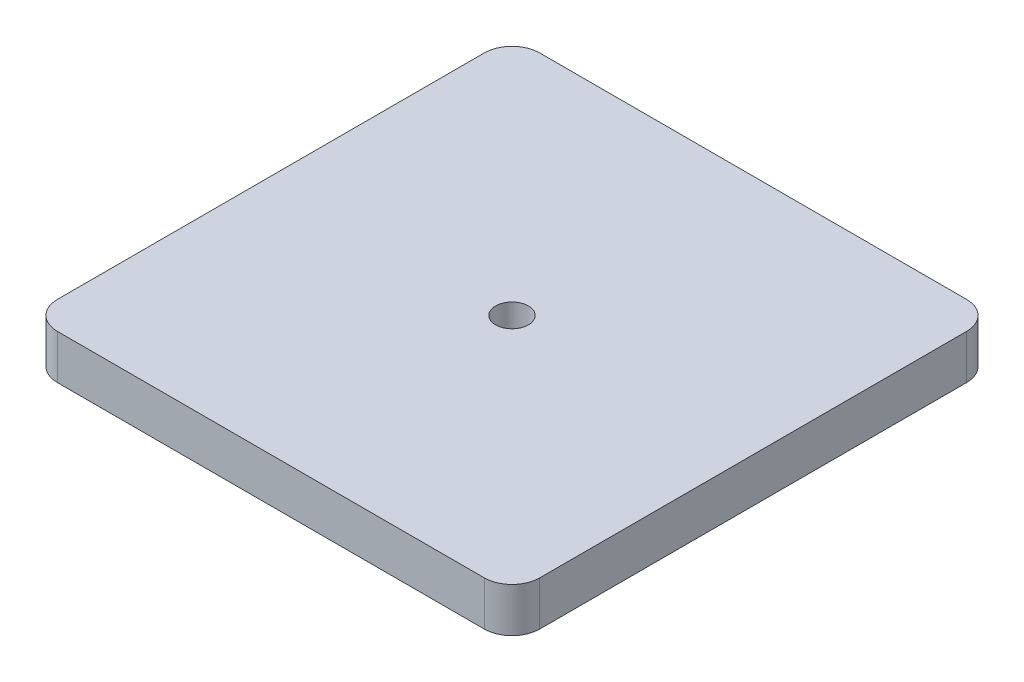
ISO-10303-21;
HEADER;
FILE_DESCRIPTION(('STEP AP214'),'2;1');
FILE_NAME('part.step','',(''),(''),'','','');
FILE_SCHEMA(('AUTOMOTIVE_DESIGN { 1 0 10303 214 1 1 1 1 }'));
ENDSEC;
DATA;
#1=APPLICATION_CONTEXT('core data for automotive mechanical design processes');
#2=APPLICATION_PROTOCOL_DEFINITION('international standard','automotive_design',2000,#1);
#3=PRODUCT_CONTEXT('',#1,'mechanical');
#4=PRODUCT('Part','Part','',(#3));
#5=PRODUCT_RELATED_PRODUCT_CATEGORY('part','',(#4));
#6=PRODUCT_DEFINITION_FORMATION('','',#4);
#7=PRODUCT_DEFINITION_CONTEXT('part definition',#1,'design');
#8=PRODUCT_DEFINITION('design','',#6,#7);
#9=PRODUCT_DEFINITION_SHAPE('','',#8);
#10=(LENGTH_UNIT() NAMED_UNIT(*) SI_UNIT(.MILLI.,.METRE.));
#11=(NAMED_UNIT(*) PLANE_ANGLE_UNIT() SI_UNIT($,.RADIAN.));
#12=(NAMED_UNIT(*) SI_UNIT($,.STERADIAN.) SOLID_ANGLE_UNIT());
#13=UNCERTAINTY_MEASURE_WITH_UNIT(LENGTH_MEASURE(1.E-05),#10,'distance_accuracy_value','');
#14=(GEOMETRIC_REPRESENTATION_CONTEXT(3) GLOBAL_UNCERTAINTY_ASSIGNED_CONTEXT((#13)) GLOBAL_UNIT_ASSIGNED_CONTEXT((#10,
#11,#12)) REPRESENTATION_CONTEXT('',''));
#15=CARTESIAN_POINT('',(0.,0.,0.));
#16=DIRECTION('',(0.,0.,1.));
#17=DIRECTION('',(1.,0.,0.));
#18=AXIS2_PLACEMENT_3D('',#15,#16,#17);
#19=CARTESIAN_POINT('',(-21.0531125863701,43.5083666055784,-2.40084026134283));
#20=DIRECTION('',(0.,-1.,0.));
#21=DIRECTION('',(0.,0.,-1.));
#22=AXIS2_PLACEMENT_3D('',#19,#20,#21);
#23=PLANE('',#22);
#24=CARTESIAN_POINT('',(-29.7531125863701,43.5083666055784,6.29915973865718));
#25=DIRECTION('',(0.,1.,0.));
#26=DIRECTION('',(0.,0.,1.));
#27=AXIS2_PLACEMENT_3D('',#24,#25,#26);
#28=CIRCLE('',#27,0.592169217935294);
#29=CARTESIAN_POINT('',(-29.7531125863701,43.5083666055784,6.89132895659247));
#30=VERTEX_POINT('',#29);
#31=EDGE_CURVE('E104',#30,#30,#28,.T.);
#32=ORIENTED_EDGE('',*,*,#31,.T.);
#33=EDGE_LOOP('',(#32));
#34=FACE_BOUND('',#33,.T.);
#35=DIRECTION('',(0.,0.,1.));
#36=VECTOR('',#35,1.);
#37=CARTESIAN_POINT('',(-38.4531125863701,43.5083666055784,14.9991597386572));
#38=LINE('',#37,#36);
#39=CARTESIAN_POINT('',(-38.4531125863701,43.5083666055784,13.9991597386572));
#40=VERTEX_POINT('',#39);
#41=CARTESIAN_POINT('',(-38.4531125863701,43.5083666055784,-1.40084026134283));
#42=VERTEX_POINT('',#41);
#43=EDGE_CURVE('E110',#40,#42,#38,.F.);
#44=ORIENTED_EDGE('',*,*,#43,.T.);
#45=CARTESIAN_POINT('',(-37.4531125863701,43.5083666055784,-1.40084026134283));
#46=DIRECTION('',(0.,-1.,0.));
#47=DIRECTION('',(0.,0.,-1.));
#48=AXIS2_PLACEMENT_3D('',#45,#46,#47);
#49=CIRCLE('',#48,1.);
#50=CARTESIAN_POINT('',(-37.4531125863701,43.5083666055784,-2.40084026134283));
#51=VERTEX_POINT('',#50);
#52=EDGE_CURVE('E111',#51,#42,#49,.F.);
#53=ORIENTED_EDGE('',*,*,#52,.F.);
#54=DIRECTION('',(1.,0.,0.));
#55=VECTOR('',#54,1.);
#56=CARTESIAN_POINT('',(-38.4531125863701,43.5083666055784,-2.40084026134283));
#57=LINE('',#56,#55);
#58=CARTESIAN_POINT('',(-22.0531125863701,43.5083666055784,-2.40084026134283));
#59=VERTEX_POINT('',#58);
#60=EDGE_CURVE('E105',#51,#59,#57,.T.);
#61=ORIENTED_EDGE('',*,*,#60,.T.);
#62=CARTESIAN_POINT('',(-22.0531125863701,43.5083666055784,-1.40084026134283));
#63=DIRECTION('',(0.,-1.,0.));
#64=DIRECTION('',(0.,0.,-1.));
#65=AXIS2_PLACEMENT_3D('',#62,#63,#64);
#66=CIRCLE('',#65,1.);
#67=CARTESIAN_POINT('',(-21.0531125863701,43.5083666055784,-1.40084026134283));
#68=VERTEX_POINT('',#67);
#69=EDGE_CURVE('E108',#68,#59,#66,.F.);
#70=ORIENTED_EDGE('',*,*,#69,.F.);
#71=DIRECTION('',(0.,0.,1.));
#72=VECTOR('',#71,1.);
#73=CARTESIAN_POINT('',(-21.0531125863701,43.5083666055784,14.9991597386572));
#74=LINE('',#73,#72);
#75=CARTESIAN_POINT('',(-21.0531125863701,43.5083666055784,13.9991597386572));
#76=VERTEX_POINT('',#75);
#77=EDGE_CURVE('E83',#68,#76,#74,.T.);
#78=ORIENTED_EDGE('',*,*,#77,.T.);
#79=CARTESIAN_POINT('',(-22.0531125863701,43.5083666055784,13.9991597386572));
#80=DIRECTION('',(0.,-1.,0.));
#81=DIRECTION('',(0.,0.,-1.));
#82=AXIS2_PLACEMENT_3D('',#79,#80,#81);
#83=CIRCLE('',#82,1.);
#84=CARTESIAN_POINT('',(-22.0531125863701,43.5083666055784,14.9991597386572));
#85=VERTEX_POINT('',#84);
#86=EDGE_CURVE('E18',#85,#76,#83,.F.);
#87=ORIENTED_EDGE('',*,*,#86,.F.);
#88=DIRECTION('',(-1.,0.,0.));
#89=VECTOR('',#88,1.);
#90=CARTESIAN_POINT('',(-38.4531125863701,43.5083666055784,14.9991597386572));
#91=LINE('',#90,#89);
#92=CARTESIAN_POINT('',(-37.4531125863701,43.5083666055784,14.9991597386572));
#93=VERTEX_POINT('',#92);
#94=EDGE_CURVE('E81',#85,#93,#91,.T.);
#95=ORIENTED_EDGE('',*,*,#94,.T.);
#96=CARTESIAN_POINT('',(-37.4531125863701,43.5083666055784,13.9991597386572));
#97=DIRECTION('',(0.,-1.,0.));
#98=DIRECTION('',(0.,0.,-1.));
#99=AXIS2_PLACEMENT_3D('',#96,#97,#98);
#100=CIRCLE('',#99,1.);
#101=EDGE_CURVE('E94',#40,#93,#100,.F.);
#102=ORIENTED_EDGE('',*,*,#101,.F.);
#103=EDGE_LOOP('',(#44,#53,#61,#70,#78,#87,#95,#102));
#104=FACE_BOUND('',#103,.T.);
#105=ADVANCED_FACE('F15',(#34,#104),#23,.T.);
#106=CARTESIAN_POINT('',(-22.0531125863701,43.5083666055784,13.9991597386572));
#107=DIRECTION('',(0.,-1.,0.));
#108=DIRECTION('',(0.,0.,-1.));
#109=AXIS2_PLACEMENT_3D('',#106,#107,#108);
#110=CYLINDRICAL_SURFACE('',#109,1.);
#111=CARTESIAN_POINT('',(-22.0531125863701,45.1083666055784,13.9991597386572));
#112=DIRECTION('',(0.,-1.,0.));
#113=DIRECTION('',(0.,0.,-1.));
#114=AXIS2_PLACEMENT_3D('',#111,#112,#113);
#115=CIRCLE('',#114,1.);
#116=CARTESIAN_POINT('',(-21.0531125863701,45.1083666055784,13.9991597386572));
#117=VERTEX_POINT('',#116);
#118=CARTESIAN_POINT('',(-22.0531125863701,45.1083666055784,14.9991597386572));
#119=VERTEX_POINT('',#118);
#120=EDGE_CURVE('E98',#117,#119,#115,.T.);
#121=ORIENTED_EDGE('',*,*,#120,.T.);
#122=DIRECTION('',(0.,1.,0.));
#123=VECTOR('',#122,1.);
#124=CARTESIAN_POINT('',(-22.0531125863701,43.5083666055784,14.9991597386572));
#125=LINE('',#124,#123);
#126=EDGE_CURVE('E88',#119,#85,#125,.F.);
#127=ORIENTED_EDGE('',*,*,#126,.T.);
#128=ORIENTED_EDGE('',*,*,#86,.T.);
#129=DIRECTION('',(0.,1.,0.));
#130=VECTOR('',#129,1.);
#131=CARTESIAN_POINT('',(-21.0531125863701,43.5083666055784,13.9991597386572));
#132=LINE('',#131,#130);
#133=EDGE_CURVE('E140',#76,#117,#132,.T.);
#134=ORIENTED_EDGE('',*,*,#133,.T.);
#135=EDGE_LOOP('',(#121,#127,#128,#134));
#136=FACE_BOUND('',#135,.T.);
#137=ADVANCED_FACE('F97',(#136),#110,.T.);
#138=CARTESIAN_POINT('',(-38.4531125863701,43.5083666055784,14.9991597386572));
#139=DIRECTION('',(0.,0.,-1.));
#140=DIRECTION('',(-1.,0.,0.));
#141=AXIS2_PLACEMENT_3D('',#138,#139,#140);
#142=PLANE('',#141);
#143=ORIENTED_EDGE('',*,*,#126,.F.);
#144=DIRECTION('',(1.,0.,0.));
#145=VECTOR('',#144,1.);
#146=CARTESIAN_POINT('',(-21.0531125863701,45.1083666055784,14.9991597386572));
#147=LINE('',#146,#145);
#148=CARTESIAN_POINT('',(-37.4531125863701,45.1083666055784,14.9991597386572));
#149=VERTEX_POINT('',#148);
#150=EDGE_CURVE('E125',#119,#149,#147,.F.);
#151=ORIENTED_EDGE('',*,*,#150,.T.);
#152=DIRECTION('',(0.,-1.,0.));
#153=VECTOR('',#152,1.);
#154=CARTESIAN_POINT('',(-37.4531125863701,43.5083666055784,14.9991597386572));
#155=LINE('',#154,#153);
#156=EDGE_CURVE('E93',#93,#149,#155,.F.);
#157=ORIENTED_EDGE('',*,*,#156,.F.);
#158=ORIENTED_EDGE('',*,*,#94,.F.);
#159=EDGE_LOOP('',(#143,#151,#157,#158));
#160=FACE_BOUND('',#159,.T.);
#161=ADVANCED_FACE('F90',(#160),#142,.F.);
#162=CARTESIAN_POINT('',(-37.4531125863701,43.5083666055784,13.9991597386572));
#163=DIRECTION('',(0.,-1.,0.));
#164=DIRECTION('',(0.,0.,-1.));
#165=AXIS2_PLACEMENT_3D('',#162,#163,#164);
#166=CYLINDRICAL_SURFACE('',#165,1.);
#167=CARTESIAN_POINT('',(-37.4531125863701,45.1083666055784,13.9991597386572));
#168=DIRECTION('',(0.,-1.,0.));
#169=DIRECTION('',(0.,0.,-1.));
#170=AXIS2_PLACEMENT_3D('',#167,#168,#169);
#171=CIRCLE('',#170,1.);
#172=CARTESIAN_POINT('',(-38.4531125863701,45.1083666055784,13.9991597386572));
#173=VERTEX_POINT('',#172);
#174=EDGE_CURVE('E122',#149,#173,#171,.T.);
#175=ORIENTED_EDGE('',*,*,#174,.T.);
#176=DIRECTION('',(0.,1.,0.));
#177=VECTOR('',#176,1.);
#178=CARTESIAN_POINT('',(-38.4531125863701,43.5083666055784,13.9991597386572));
#179=LINE('',#178,#177);
#180=EDGE_CURVE('E112',#173,#40,#179,.F.);
#181=ORIENTED_EDGE('',*,*,#180,.T.);
#182=ORIENTED_EDGE('',*,*,#101,.T.);
#183=ORIENTED_EDGE('',*,*,#156,.T.);
#184=EDGE_LOOP('',(#175,#181,#182,#183));
#185=FACE_BOUND('',#184,.T.);
#186=ADVANCED_FACE('F167',(#185),#166,.T.);
#187=CARTESIAN_POINT('',(-38.4531125863701,43.5083666055784,14.9991597386572));
#188=DIRECTION('',(1.,0.,0.));
#189=DIRECTION('',(0.,1.,0.));
#190=AXIS2_PLACEMENT_3D('',#187,#188,#189);
#191=PLANE('',#190);
#192=ORIENTED_EDGE('',*,*,#180,.F.);
#193=DIRECTION('',(0.,0.,-1.));
#194=VECTOR('',#193,1.);
#195=CARTESIAN_POINT('',(-38.4531125863701,45.1083666055784,-2.40084026134283));
#196=LINE('',#195,#194);
#197=CARTESIAN_POINT('',(-38.4531125863701,45.1083666055784,-1.40084026134283));
#198=VERTEX_POINT('',#197);
#199=EDGE_CURVE('E121',#173,#198,#196,.T.);
#200=ORIENTED_EDGE('',*,*,#199,.T.);
#201=DIRECTION('',(0.,-1.,0.));
#202=VECTOR('',#201,1.);
#203=CARTESIAN_POINT('',(-38.4531125863701,43.5083666055784,-1.40084026134283));
#204=LINE('',#203,#202);
#205=EDGE_CURVE('E131',#42,#198,#204,.F.);
#206=ORIENTED_EDGE('',*,*,#205,.F.);
#207=ORIENTED_EDGE('',*,*,#43,.F.);
#208=EDGE_LOOP('',(#192,#200,#206,#207));
#209=FACE_BOUND('',#208,.T.);
#210=ADVANCED_FACE('F166',(#209),#191,.F.);
#211=CARTESIAN_POINT('',(-37.4531125863701,43.5083666055784,-1.40084026134283));
#212=DIRECTION('',(0.,-1.,0.));
#213=DIRECTION('',(0.,0.,-1.));
#214=AXIS2_PLACEMENT_3D('',#211,#212,#213);
#215=CYLINDRICAL_SURFACE('',#214,1.);
#216=CARTESIAN_POINT('',(-37.4531125863701,45.1083666055784,-1.40084026134283));
#217=DIRECTION('',(0.,-1.,0.));
#218=DIRECTION('',(0.,0.,-1.));
#219=AXIS2_PLACEMENT_3D('',#216,#217,#218);
#220=CIRCLE('',#219,1.);
#221=CARTESIAN_POINT('',(-37.4531125863701,45.1083666055784,-2.40084026134283));
#222=VERTEX_POINT('',#221);
#223=EDGE_CURVE('E118',#198,#222,#220,.T.);
#224=ORIENTED_EDGE('',*,*,#223,.T.);
#225=DIRECTION('',(0.,1.,0.));
#226=VECTOR('',#225,1.);
#227=CARTESIAN_POINT('',(-37.4531125863701,43.5083666055784,-2.40084026134283));
#228=LINE('',#227,#226);
#229=EDGE_CURVE('E109',#222,#51,#228,.F.);
#230=ORIENTED_EDGE('',*,*,#229,.T.);
#231=ORIENTED_EDGE('',*,*,#52,.T.);
#232=ORIENTED_EDGE('',*,*,#205,.T.);
#233=EDGE_LOOP('',(#224,#230,#231,#232));
#234=FACE_BOUND('',#233,.T.);
#235=ADVANCED_FACE('F162',(#234),#215,.T.);
#236=CARTESIAN_POINT('',(-38.4531125863701,43.5083666055784,-2.40084026134283));
#237=DIRECTION('',(0.,0.,1.));
#238=DIRECTION('',(1.,0.,0.));
#239=AXIS2_PLACEMENT_3D('',#236,#237,#238);
#240=PLANE('',#239);
#241=DIRECTION('',(0.,-1.,0.));
#242=VECTOR('',#241,1.);
#243=CARTESIAN_POINT('',(-22.0531125863701,43.5083666055784,-2.40084026134283));
#244=LINE('',#243,#242);
#245=CARTESIAN_POINT('',(-22.0531125863701,45.1083666055784,-2.40084026134283));
#246=VERTEX_POINT('',#245);
#247=EDGE_CURVE('E130',#59,#246,#244,.F.);
#248=ORIENTED_EDGE('',*,*,#247,.F.);
#249=ORIENTED_EDGE('',*,*,#60,.F.);
#250=ORIENTED_EDGE('',*,*,#229,.F.);
#251=DIRECTION('',(1.,0.,0.));
#252=VECTOR('',#251,1.);
#253=CARTESIAN_POINT('',(-21.0531125863701,45.1083666055784,-2.40084026134283));
#254=LINE('',#253,#252);
#255=EDGE_CURVE('E117',#222,#246,#254,.T.);
#256=ORIENTED_EDGE('',*,*,#255,.T.);
#257=EDGE_LOOP('',(#248,#249,#250,#256));
#258=FACE_BOUND('',#257,.T.);
#259=ADVANCED_FACE('F158',(#258),#240,.F.);
#260=CARTESIAN_POINT('',(-22.0531125863701,43.5083666055784,-1.40084026134283));
#261=DIRECTION('',(0.,-1.,0.));
#262=DIRECTION('',(0.,0.,-1.));
#263=AXIS2_PLACEMENT_3D('',#260,#261,#262);
#264=CYLINDRICAL_SURFACE('',#263,1.);
#265=CARTESIAN_POINT('',(-22.0531125863701,45.1083666055784,-1.40084026134283));
#266=DIRECTION('',(0.,-1.,0.));
#267=DIRECTION('',(0.,0.,-1.));
#268=AXIS2_PLACEMENT_3D('',#265,#266,#267);
#269=CIRCLE('',#268,1.);
#270=CARTESIAN_POINT('',(-21.0531125863701,45.1083666055784,-1.40084026134283));
#271=VERTEX_POINT('',#270);
#272=EDGE_CURVE('E114',#246,#271,#269,.T.);
#273=ORIENTED_EDGE('',*,*,#272,.T.);
#274=DIRECTION('',(0.,1.,0.));
#275=VECTOR('',#274,1.);
#276=CARTESIAN_POINT('',(-21.0531125863701,43.5083666055784,-1.40084026134283));
#277=LINE('',#276,#275);
#278=EDGE_CURVE('E33',#271,#68,#277,.F.);
#279=ORIENTED_EDGE('',*,*,#278,.T.);
#280=ORIENTED_EDGE('',*,*,#69,.T.);
#281=ORIENTED_EDGE('',*,*,#247,.T.);
#282=EDGE_LOOP('',(#273,#279,#280,#281));
#283=FACE_BOUND('',#282,.T.);
#284=ADVANCED_FACE('F154',(#283),#264,.T.);
#285=CARTESIAN_POINT('',(-21.0531125863701,43.5083666055784,14.9991597386572));
#286=DIRECTION('',(-1.,0.,0.));
#287=DIRECTION('',(0.,0.,1.));
#288=AXIS2_PLACEMENT_3D('',#285,#286,#287);
#289=PLANE('',#288);
#290=ORIENTED_EDGE('',*,*,#278,.F.);
#291=DIRECTION('',(0.,0.,-1.));
#292=VECTOR('',#291,1.);
#293=CARTESIAN_POINT('',(-21.0531125863701,45.1083666055784,-2.40084026134283));
#294=LINE('',#293,#292);
#295=EDGE_CURVE('E24',#271,#117,#294,.F.);
#296=ORIENTED_EDGE('',*,*,#295,.T.);
#297=ORIENTED_EDGE('',*,*,#133,.F.);
#298=ORIENTED_EDGE('',*,*,#77,.F.);
#299=EDGE_LOOP('',(#290,#296,#297,#298));
#300=FACE_BOUND('',#299,.T.);
#301=ADVANCED_FACE('F148',(#300),#289,.F.);
#302=CARTESIAN_POINT('',(-29.7531125863701,45.1083666055784,6.29915973865718));
#303=DIRECTION('',(0.,1.,0.));
#304=DIRECTION('',(0.,0.,1.));
#305=AXIS2_PLACEMENT_3D('',#302,#303,#304);
#306=CYLINDRICAL_SURFACE('',#305,0.592169217935294);
#307=ORIENTED_EDGE('',*,*,#31,.F.);
#308=EDGE_LOOP('',(#307));
#309=FACE_BOUND('',#308,.T.);
#310=CARTESIAN_POINT('',(-29.7531125863701,45.1083666055784,6.29915973865718));
#311=DIRECTION('',(0.,1.,0.));
#312=DIRECTION('',(0.,0.,1.));
#313=AXIS2_PLACEMENT_3D('',#310,#311,#312);
#314=CIRCLE('',#313,0.592169217935294);
#315=CARTESIAN_POINT('',(-29.7531125863701,45.1083666055784,6.89132895659247));
#316=VERTEX_POINT('',#315);
#317=EDGE_CURVE('E10',#316,#316,#314,.T.);
#318=ORIENTED_EDGE('',*,*,#317,.T.);
#319=EDGE_LOOP('',(#318));
#320=FACE_BOUND('',#319,.T.);
#321=ADVANCED_FACE('F178',(#309,#320),#306,.F.);
#322=CARTESIAN_POINT('',(-21.0531125863701,45.1083666055784,-2.40084026134283));
#323=DIRECTION('',(0.,-1.,0.));
#324=DIRECTION('',(0.,0.,-1.));
#325=AXIS2_PLACEMENT_3D('',#322,#323,#324);
#326=PLANE('',#325);
#327=ORIENTED_EDGE('',*,*,#317,.F.);
#328=EDGE_LOOP('',(#327));
#329=FACE_BOUND('',#328,.T.);
#330=ORIENTED_EDGE('',*,*,#272,.F.);
#331=ORIENTED_EDGE('',*,*,#255,.F.);
#332=ORIENTED_EDGE('',*,*,#223,.F.);
#333=ORIENTED_EDGE('',*,*,#199,.F.);
#334=ORIENTED_EDGE('',*,*,#174,.F.);
#335=ORIENTED_EDGE('',*,*,#150,.F.);
#336=ORIENTED_EDGE('',*,*,#120,.F.);
#337=ORIENTED_EDGE('',*,*,#295,.F.);
#338=EDGE_LOOP('',(#330,#331,#332,#333,#334,#335,#336,#337));
#339=FACE_BOUND('',#338,.T.);
#340=ADVANCED_FACE('F151',(#329,#339),#326,.F.);
#341=CLOSED_SHELL('',(#105,#137,#161,#186,#210,#235,#259,#284,#301,#321,#340));
#342=MANIFOLD_SOLID_BREP('B1',#341);
#343=ADVANCED_BREP_SHAPE_REPRESENTATION('',(#18,#342),#14);
#344=SHAPE_DEFINITION_REPRESENTATION(#9,#343);
ENDSEC;
END-ISO-10303-21;
